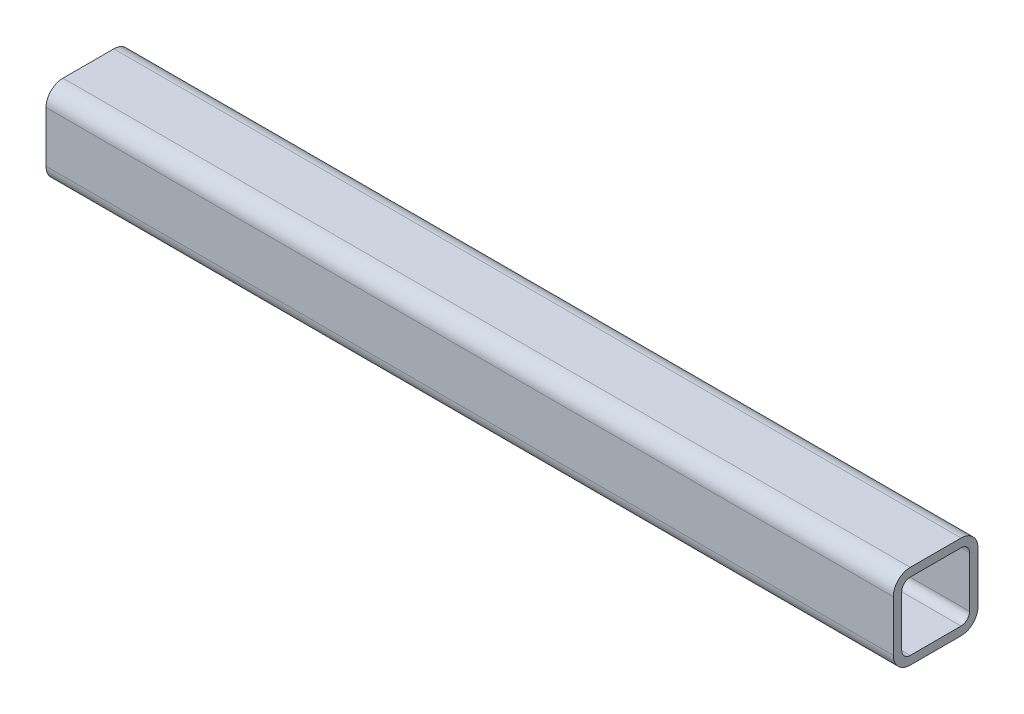
ISO-10303-21;
HEADER;
FILE_DESCRIPTION(('STEP AP214'),'2;1');
FILE_NAME('part.step','',(''),(''),'','','');
FILE_SCHEMA(('AUTOMOTIVE_DESIGN { 1 0 10303 214 1 1 1 1 }'));
ENDSEC;
DATA;
#1=APPLICATION_CONTEXT('core data for automotive mechanical design processes');
#2=APPLICATION_PROTOCOL_DEFINITION('international standard','automotive_design',2000,#1);
#3=PRODUCT_CONTEXT('',#1,'mechanical');
#4=PRODUCT('Part','Part','',(#3));
#5=PRODUCT_RELATED_PRODUCT_CATEGORY('part','',(#4));
#6=PRODUCT_DEFINITION_FORMATION('','',#4);
#7=PRODUCT_DEFINITION_CONTEXT('part definition',#1,'design');
#8=PRODUCT_DEFINITION('design','',#6,#7);
#9=PRODUCT_DEFINITION_SHAPE('','',#8);
#10=(LENGTH_UNIT() NAMED_UNIT(*) SI_UNIT(.MILLI.,.METRE.));
#11=(NAMED_UNIT(*) PLANE_ANGLE_UNIT() SI_UNIT($,.RADIAN.));
#12=(NAMED_UNIT(*) SI_UNIT($,.STERADIAN.) SOLID_ANGLE_UNIT());
#13=UNCERTAINTY_MEASURE_WITH_UNIT(LENGTH_MEASURE(1.E-05),#10,'distance_accuracy_value','');
#14=(GEOMETRIC_REPRESENTATION_CONTEXT(3) GLOBAL_UNCERTAINTY_ASSIGNED_CONTEXT((#13)) GLOBAL_UNIT_ASSIGNED_CONTEXT((#10,
#11,#12)) REPRESENTATION_CONTEXT('',''));
#15=CARTESIAN_POINT('',(0.,0.,0.));
#16=DIRECTION('',(0.,0.,1.));
#17=DIRECTION('',(1.,0.,0.));
#18=AXIS2_PLACEMENT_3D('',#15,#16,#17);
#19=CARTESIAN_POINT('',(99.9999999999993,-80.0000000000002,-559.));
#20=DIRECTION('',(1.,0.,0.));
#21=DIRECTION('',(0.,0.,-1.));
#22=AXIS2_PLACEMENT_3D('',#19,#20,#21);
#23=PLANE('',#22);
#24=DIRECTION('',(0.,1.,0.));
#25=VECTOR('',#24,1.);
#26=CARTESIAN_POINT('',(99.9999999999993,-86.,-560.));
#27=LINE('',#26,#25);
#28=CARTESIAN_POINT('',(99.9999999999993,-86.0000000000005,-560.));
#29=VERTEX_POINT('',#28);
#30=CARTESIAN_POINT('',(99.9999999999993,-74.0000000000005,-560.));
#31=VERTEX_POINT('',#30);
#32=EDGE_CURVE('E11',#29,#31,#27,.T.);
#33=ORIENTED_EDGE('',*,*,#32,.T.);
#34=CARTESIAN_POINT('',(99.9999999999993,-74.,-556.));
#35=DIRECTION('',(1.,0.,0.));
#36=DIRECTION('',(0.,0.,-1.));
#37=AXIS2_PLACEMENT_3D('',#34,#35,#36);
#38=CIRCLE('',#37,4.);
#39=CARTESIAN_POINT('',(99.9999999999993,-70.,-556.));
#40=VERTEX_POINT('',#39);
#41=EDGE_CURVE('E249',#31,#40,#38,.T.);
#42=ORIENTED_EDGE('',*,*,#41,.T.);
#43=DIRECTION('',(0.,0.,1.));
#44=VECTOR('',#43,1.);
#45=CARTESIAN_POINT('',(99.9999999999993,-70.,-544.));
#46=LINE('',#45,#44);
#47=CARTESIAN_POINT('',(99.9999999999993,-70.,-544.));
#48=VERTEX_POINT('',#47);
#49=EDGE_CURVE('E246',#40,#48,#46,.T.);
#50=ORIENTED_EDGE('',*,*,#49,.T.);
#51=CARTESIAN_POINT('',(99.9999999999993,-74.,-544.));
#52=DIRECTION('',(1.,0.,0.));
#53=DIRECTION('',(0.,0.,-1.));
#54=AXIS2_PLACEMENT_3D('',#51,#52,#53);
#55=CIRCLE('',#54,4.);
#56=CARTESIAN_POINT('',(99.9999999999993,-74.,-540.));
#57=VERTEX_POINT('',#56);
#58=EDGE_CURVE('E243',#48,#57,#55,.T.);
#59=ORIENTED_EDGE('',*,*,#58,.T.);
#60=DIRECTION('',(0.,-1.,0.));
#61=VECTOR('',#60,1.);
#62=CARTESIAN_POINT('',(99.9999999999993,-74.,-540.));
#63=LINE('',#62,#61);
#64=CARTESIAN_POINT('',(99.9999999999993,-86.,-540.));
#65=VERTEX_POINT('',#64);
#66=EDGE_CURVE('E240',#57,#65,#63,.T.);
#67=ORIENTED_EDGE('',*,*,#66,.T.);
#68=CARTESIAN_POINT('',(99.9999999999993,-86.,-544.));
#69=DIRECTION('',(1.,0.,0.));
#70=DIRECTION('',(0.,0.,-1.));
#71=AXIS2_PLACEMENT_3D('',#68,#69,#70);
#72=CIRCLE('',#71,4.);
#73=CARTESIAN_POINT('',(99.9999999999993,-90.,-544.));
#74=VERTEX_POINT('',#73);
#75=EDGE_CURVE('E237',#65,#74,#72,.T.);
#76=ORIENTED_EDGE('',*,*,#75,.T.);
#77=DIRECTION('',(0.,0.,-1.));
#78=VECTOR('',#77,1.);
#79=CARTESIAN_POINT('',(99.9999999999993,-90.,-556.));
#80=LINE('',#79,#78);
#81=CARTESIAN_POINT('',(99.9999999999993,-90.,-556.));
#82=VERTEX_POINT('',#81);
#83=EDGE_CURVE('E234',#74,#82,#80,.T.);
#84=ORIENTED_EDGE('',*,*,#83,.T.);
#85=CARTESIAN_POINT('',(99.9999999999993,-86.,-556.));
#86=DIRECTION('',(1.,0.,0.));
#87=DIRECTION('',(0.,0.,-1.));
#88=AXIS2_PLACEMENT_3D('',#85,#86,#87);
#89=CIRCLE('',#88,4.);
#90=EDGE_CURVE('E185',#82,#29,#89,.T.);
#91=ORIENTED_EDGE('',*,*,#90,.T.);
#92=EDGE_LOOP('',(#33,#42,#50,#59,#67,#76,#84,#91));
#93=FACE_BOUND('',#92,.T.);
#94=CARTESIAN_POINT('',(99.9999999999993,-74.,-556.));
#95=DIRECTION('',(1.,0.,0.));
#96=DIRECTION('',(0.,0.,-1.));
#97=AXIS2_PLACEMENT_3D('',#94,#95,#96);
#98=CIRCLE('',#97,2.);
#99=CARTESIAN_POINT('',(99.9999999999993,-74.,-558.));
#100=VERTEX_POINT('',#99);
#101=CARTESIAN_POINT('',(99.9999999999993,-72.,-556.));
#102=VERTEX_POINT('',#101);
#103=EDGE_CURVE('E217',#100,#102,#98,.T.);
#104=ORIENTED_EDGE('',*,*,#103,.F.);
#105=DIRECTION('',(0.,1.,0.));
#106=VECTOR('',#105,1.);
#107=CARTESIAN_POINT('',(99.9999999999993,-86.,-558.));
#108=LINE('',#107,#106);
#109=CARTESIAN_POINT('',(99.9999999999993,-86.0000000000005,-558.));
#110=VERTEX_POINT('',#109);
#111=EDGE_CURVE('E173',#110,#100,#108,.T.);
#112=ORIENTED_EDGE('',*,*,#111,.F.);
#113=CARTESIAN_POINT('',(99.9999999999993,-86.,-556.));
#114=DIRECTION('',(1.,0.,0.));
#115=DIRECTION('',(0.,0.,-1.));
#116=AXIS2_PLACEMENT_3D('',#113,#114,#115);
#117=CIRCLE('',#116,2.);
#118=CARTESIAN_POINT('',(99.9999999999993,-88.,-556.));
#119=VERTEX_POINT('',#118);
#120=EDGE_CURVE('E70',#119,#110,#117,.T.);
#121=ORIENTED_EDGE('',*,*,#120,.F.);
#122=DIRECTION('',(0.,0.,-1.));
#123=VECTOR('',#122,1.);
#124=CARTESIAN_POINT('',(99.9999999999993,-88.,-556.));
#125=LINE('',#124,#123);
#126=CARTESIAN_POINT('',(99.9999999999993,-88.,-544.));
#127=VERTEX_POINT('',#126);
#128=EDGE_CURVE('E82',#127,#119,#125,.T.);
#129=ORIENTED_EDGE('',*,*,#128,.F.);
#130=CARTESIAN_POINT('',(99.9999999999993,-86.,-544.));
#131=DIRECTION('',(1.,0.,0.));
#132=DIRECTION('',(0.,0.,-1.));
#133=AXIS2_PLACEMENT_3D('',#130,#131,#132);
#134=CIRCLE('',#133,2.);
#135=CARTESIAN_POINT('',(99.9999999999993,-86.,-542.));
#136=VERTEX_POINT('',#135);
#137=EDGE_CURVE('E222',#136,#127,#134,.T.);
#138=ORIENTED_EDGE('',*,*,#137,.F.);
#139=DIRECTION('',(0.,-1.,0.));
#140=VECTOR('',#139,1.);
#141=CARTESIAN_POINT('',(99.9999999999993,-74.,-542.));
#142=LINE('',#141,#140);
#143=CARTESIAN_POINT('',(99.9999999999993,-74.,-542.));
#144=VERTEX_POINT('',#143);
#145=EDGE_CURVE('E212',#144,#136,#142,.T.);
#146=ORIENTED_EDGE('',*,*,#145,.F.);
#147=CARTESIAN_POINT('',(99.9999999999993,-74.,-544.));
#148=DIRECTION('',(1.,0.,0.));
#149=DIRECTION('',(0.,0.,-1.));
#150=AXIS2_PLACEMENT_3D('',#147,#148,#149);
#151=CIRCLE('',#150,2.);
#152=CARTESIAN_POINT('',(99.9999999999993,-72.,-544.));
#153=VERTEX_POINT('',#152);
#154=EDGE_CURVE('E209',#153,#144,#151,.T.);
#155=ORIENTED_EDGE('',*,*,#154,.F.);
#156=DIRECTION('',(0.,0.,1.));
#157=VECTOR('',#156,1.);
#158=CARTESIAN_POINT('',(99.9999999999993,-72.,-544.));
#159=LINE('',#158,#157);
#160=EDGE_CURVE('E204',#102,#153,#159,.T.);
#161=ORIENTED_EDGE('',*,*,#160,.F.);
#162=EDGE_LOOP('',(#104,#112,#121,#129,#138,#146,#155,#161));
#163=FACE_BOUND('',#162,.T.);
#164=ADVANCED_FACE('F41',(#93,#163),#23,.T.);
#165=CARTESIAN_POINT('',(-100.,-74.0000000000004,-550.));
#166=DIRECTION('',(-1.,0.,0.));
#167=DIRECTION('',(0.,0.,1.));
#168=AXIS2_PLACEMENT_3D('',#165,#166,#167);
#169=PLANE('',#168);
#170=CARTESIAN_POINT('',(-100.,-74.,-556.));
#171=DIRECTION('',(-1.,0.,0.));
#172=DIRECTION('',(0.,0.,1.));
#173=AXIS2_PLACEMENT_3D('',#170,#171,#172);
#174=CIRCLE('',#173,4.);
#175=CARTESIAN_POINT('',(-100.,-70.,-556.));
#176=VERTEX_POINT('',#175);
#177=CARTESIAN_POINT('',(-100.,-74.0000000000004,-560.));
#178=VERTEX_POINT('',#177);
#179=EDGE_CURVE('E190',#176,#178,#174,.T.);
#180=ORIENTED_EDGE('',*,*,#179,.T.);
#181=DIRECTION('',(0.,-1.,0.));
#182=VECTOR('',#181,1.);
#183=CARTESIAN_POINT('',(-100.,-86.,-560.));
#184=LINE('',#183,#182);
#185=CARTESIAN_POINT('',(-100.,-86.0000000000004,-560.));
#186=VERTEX_POINT('',#185);
#187=EDGE_CURVE('E182',#178,#186,#184,.T.);
#188=ORIENTED_EDGE('',*,*,#187,.T.);
#189=CARTESIAN_POINT('',(-100.,-86.,-556.));
#190=DIRECTION('',(-1.,0.,0.));
#191=DIRECTION('',(0.,0.,1.));
#192=AXIS2_PLACEMENT_3D('',#189,#190,#191);
#193=CIRCLE('',#192,4.);
#194=CARTESIAN_POINT('',(-100.,-90.,-556.));
#195=VERTEX_POINT('',#194);
#196=EDGE_CURVE('E192',#186,#195,#193,.T.);
#197=ORIENTED_EDGE('',*,*,#196,.T.);
#198=DIRECTION('',(0.,0.,1.));
#199=VECTOR('',#198,1.);
#200=CARTESIAN_POINT('',(-100.,-90.,-556.));
#201=LINE('',#200,#199);
#202=CARTESIAN_POINT('',(-100.,-90.,-544.));
#203=VERTEX_POINT('',#202);
#204=EDGE_CURVE('E194',#195,#203,#201,.T.);
#205=ORIENTED_EDGE('',*,*,#204,.T.);
#206=CARTESIAN_POINT('',(-100.,-86.,-544.));
#207=DIRECTION('',(-1.,0.,0.));
#208=DIRECTION('',(0.,0.,1.));
#209=AXIS2_PLACEMENT_3D('',#206,#207,#208);
#210=CIRCLE('',#209,4.);
#211=CARTESIAN_POINT('',(-100.,-86.,-540.));
#212=VERTEX_POINT('',#211);
#213=EDGE_CURVE('E196',#203,#212,#210,.T.);
#214=ORIENTED_EDGE('',*,*,#213,.T.);
#215=DIRECTION('',(0.,1.,0.));
#216=VECTOR('',#215,1.);
#217=CARTESIAN_POINT('',(-100.,-74.,-540.));
#218=LINE('',#217,#216);
#219=CARTESIAN_POINT('',(-100.,-74.,-540.));
#220=VERTEX_POINT('',#219);
#221=EDGE_CURVE('E184',#212,#220,#218,.T.);
#222=ORIENTED_EDGE('',*,*,#221,.T.);
#223=CARTESIAN_POINT('',(-100.,-74.,-544.));
#224=DIRECTION('',(-1.,0.,0.));
#225=DIRECTION('',(0.,0.,1.));
#226=AXIS2_PLACEMENT_3D('',#223,#224,#225);
#227=CIRCLE('',#226,4.);
#228=CARTESIAN_POINT('',(-100.,-70.,-544.));
#229=VERTEX_POINT('',#228);
#230=EDGE_CURVE('E186',#220,#229,#227,.T.);
#231=ORIENTED_EDGE('',*,*,#230,.T.);
#232=DIRECTION('',(0.,0.,-1.));
#233=VECTOR('',#232,1.);
#234=CARTESIAN_POINT('',(-100.,-70.,-544.));
#235=LINE('',#234,#233);
#236=EDGE_CURVE('E188',#229,#176,#235,.T.);
#237=ORIENTED_EDGE('',*,*,#236,.T.);
#238=EDGE_LOOP('',(#180,#188,#197,#205,#214,#222,#231,#237));
#239=FACE_BOUND('',#238,.T.);
#240=DIRECTION('',(0.,-1.,0.));
#241=VECTOR('',#240,1.);
#242=CARTESIAN_POINT('',(-100.,-86.,-558.));
#243=LINE('',#242,#241);
#244=CARTESIAN_POINT('',(-100.,-74.0000000000004,-558.));
#245=VERTEX_POINT('',#244);
#246=CARTESIAN_POINT('',(-100.,-86.,-558.));
#247=VERTEX_POINT('',#246);
#248=EDGE_CURVE('E163',#245,#247,#243,.T.);
#249=ORIENTED_EDGE('',*,*,#248,.F.);
#250=CARTESIAN_POINT('',(-100.,-74.,-556.));
#251=DIRECTION('',(-1.,0.,0.));
#252=DIRECTION('',(0.,0.,1.));
#253=AXIS2_PLACEMENT_3D('',#250,#251,#252);
#254=CIRCLE('',#253,2.);
#255=CARTESIAN_POINT('',(-100.,-72.,-556.));
#256=VERTEX_POINT('',#255);
#257=EDGE_CURVE('E213',#256,#245,#254,.T.);
#258=ORIENTED_EDGE('',*,*,#257,.F.);
#259=DIRECTION('',(0.,0.,-1.));
#260=VECTOR('',#259,1.);
#261=CARTESIAN_POINT('',(-100.,-72.,-544.));
#262=LINE('',#261,#260);
#263=CARTESIAN_POINT('',(-100.,-72.,-544.));
#264=VERTEX_POINT('',#263);
#265=EDGE_CURVE('E200',#264,#256,#262,.T.);
#266=ORIENTED_EDGE('',*,*,#265,.F.);
#267=CARTESIAN_POINT('',(-100.,-74.,-544.));
#268=DIRECTION('',(-1.,0.,0.));
#269=DIRECTION('',(0.,0.,1.));
#270=AXIS2_PLACEMENT_3D('',#267,#268,#269);
#271=CIRCLE('',#270,2.);
#272=CARTESIAN_POINT('',(-100.,-74.,-542.));
#273=VERTEX_POINT('',#272);
#274=EDGE_CURVE('E205',#273,#264,#271,.T.);
#275=ORIENTED_EDGE('',*,*,#274,.F.);
#276=DIRECTION('',(0.,1.,0.));
#277=VECTOR('',#276,1.);
#278=CARTESIAN_POINT('',(-100.,-74.,-542.));
#279=LINE('',#278,#277);
#280=CARTESIAN_POINT('',(-100.,-86.,-542.));
#281=VERTEX_POINT('',#280);
#282=EDGE_CURVE('E174',#281,#273,#279,.T.);
#283=ORIENTED_EDGE('',*,*,#282,.F.);
#284=CARTESIAN_POINT('',(-100.,-86.,-544.));
#285=DIRECTION('',(-1.,0.,0.));
#286=DIRECTION('',(0.,0.,1.));
#287=AXIS2_PLACEMENT_3D('',#284,#285,#286);
#288=CIRCLE('',#287,2.);
#289=CARTESIAN_POINT('',(-100.,-88.,-544.));
#290=VERTEX_POINT('',#289);
#291=EDGE_CURVE('E218',#290,#281,#288,.T.);
#292=ORIENTED_EDGE('',*,*,#291,.F.);
#293=DIRECTION('',(0.,0.,1.));
#294=VECTOR('',#293,1.);
#295=CARTESIAN_POINT('',(-100.,-88.,-556.));
#296=LINE('',#295,#294);
#297=CARTESIAN_POINT('',(-100.,-88.,-556.));
#298=VERTEX_POINT('',#297);
#299=EDGE_CURVE('E166',#298,#290,#296,.T.);
#300=ORIENTED_EDGE('',*,*,#299,.F.);
#301=CARTESIAN_POINT('',(-100.,-86.,-556.));
#302=DIRECTION('',(-1.,0.,0.));
#303=DIRECTION('',(0.,0.,1.));
#304=AXIS2_PLACEMENT_3D('',#301,#302,#303);
#305=CIRCLE('',#304,2.);
#306=EDGE_CURVE('E160',#247,#298,#305,.T.);
#307=ORIENTED_EDGE('',*,*,#306,.F.);
#308=EDGE_LOOP('',(#249,#258,#266,#275,#283,#292,#300,#307));
#309=FACE_BOUND('',#308,.T.);
#310=ADVANCED_FACE('F161',(#239,#309),#169,.T.);
#311=CARTESIAN_POINT('',(-110.,-86.,-544.));
#312=DIRECTION('',(1.,0.,0.));
#313=DIRECTION('',(0.,0.,-1.));
#314=AXIS2_PLACEMENT_3D('',#311,#312,#313);
#315=CYLINDRICAL_SURFACE('',#314,2.);
#316=DIRECTION('',(1.,0.,0.));
#317=VECTOR('',#316,1.);
#318=CARTESIAN_POINT('',(-110.,-86.,-542.));
#319=LINE('',#318,#317);
#320=EDGE_CURVE('E198',#281,#136,#319,.T.);
#321=ORIENTED_EDGE('',*,*,#320,.T.);
#322=ORIENTED_EDGE('',*,*,#137,.T.);
#323=DIRECTION('',(1.,0.,0.));
#324=VECTOR('',#323,1.);
#325=CARTESIAN_POINT('',(-110.,-88.,-544.));
#326=LINE('',#325,#324);
#327=EDGE_CURVE('E221',#290,#127,#326,.T.);
#328=ORIENTED_EDGE('',*,*,#327,.F.);
#329=ORIENTED_EDGE('',*,*,#291,.T.);
#330=EDGE_LOOP('',(#321,#322,#328,#329));
#331=FACE_BOUND('',#330,.T.);
#332=ADVANCED_FACE('F299',(#331),#315,.F.);
#333=CARTESIAN_POINT('',(-110.,-88.,-556.));
#334=DIRECTION('',(0.,1.,0.));
#335=DIRECTION('',(0.,0.,1.));
#336=AXIS2_PLACEMENT_3D('',#333,#334,#335);
#337=PLANE('',#336);
#338=ORIENTED_EDGE('',*,*,#327,.T.);
#339=ORIENTED_EDGE('',*,*,#128,.T.);
#340=DIRECTION('',(1.,0.,0.));
#341=VECTOR('',#340,1.);
#342=CARTESIAN_POINT('',(-110.,-88.,-556.));
#343=LINE('',#342,#341);
#344=EDGE_CURVE('E223',#298,#119,#343,.T.);
#345=ORIENTED_EDGE('',*,*,#344,.F.);
#346=ORIENTED_EDGE('',*,*,#299,.T.);
#347=EDGE_LOOP('',(#338,#339,#345,#346));
#348=FACE_BOUND('',#347,.T.);
#349=ADVANCED_FACE('F300',(#348),#337,.T.);
#350=CARTESIAN_POINT('',(-110.,-86.,-556.));
#351=DIRECTION('',(1.,0.,0.));
#352=DIRECTION('',(0.,0.,-1.));
#353=AXIS2_PLACEMENT_3D('',#350,#351,#352);
#354=CYLINDRICAL_SURFACE('',#353,2.);
#355=ORIENTED_EDGE('',*,*,#344,.T.);
#356=ORIENTED_EDGE('',*,*,#120,.T.);
#357=DIRECTION('',(1.,0.,0.));
#358=VECTOR('',#357,1.);
#359=CARTESIAN_POINT('',(-110.,-86.,-558.));
#360=LINE('',#359,#358);
#361=EDGE_CURVE('E169',#247,#110,#360,.T.);
#362=ORIENTED_EDGE('',*,*,#361,.F.);
#363=ORIENTED_EDGE('',*,*,#306,.T.);
#364=EDGE_LOOP('',(#355,#356,#362,#363));
#365=FACE_BOUND('',#364,.T.);
#366=ADVANCED_FACE('F170',(#365),#354,.F.);
#367=CARTESIAN_POINT('',(-110.,-74.,-556.));
#368=DIRECTION('',(1.,0.,0.));
#369=DIRECTION('',(0.,0.,-1.));
#370=AXIS2_PLACEMENT_3D('',#367,#368,#369);
#371=CYLINDRICAL_SURFACE('',#370,2.);
#372=DIRECTION('',(1.,0.,0.));
#373=VECTOR('',#372,1.);
#374=CARTESIAN_POINT('',(-110.,-74.,-558.));
#375=LINE('',#374,#373);
#376=EDGE_CURVE('E44',#245,#100,#375,.T.);
#377=ORIENTED_EDGE('',*,*,#376,.T.);
#378=ORIENTED_EDGE('',*,*,#103,.T.);
#379=DIRECTION('',(1.,0.,0.));
#380=VECTOR('',#379,1.);
#381=CARTESIAN_POINT('',(-110.,-72.,-556.));
#382=LINE('',#381,#380);
#383=EDGE_CURVE('E216',#256,#102,#382,.T.);
#384=ORIENTED_EDGE('',*,*,#383,.F.);
#385=ORIENTED_EDGE('',*,*,#257,.T.);
#386=EDGE_LOOP('',(#377,#378,#384,#385));
#387=FACE_BOUND('',#386,.T.);
#388=ADVANCED_FACE('F286',(#387),#371,.F.);
#389=CARTESIAN_POINT('',(-110.,-72.,-544.));
#390=DIRECTION('',(0.,-1.,0.));
#391=DIRECTION('',(0.,0.,-1.));
#392=AXIS2_PLACEMENT_3D('',#389,#390,#391);
#393=PLANE('',#392);
#394=ORIENTED_EDGE('',*,*,#383,.T.);
#395=ORIENTED_EDGE('',*,*,#160,.T.);
#396=DIRECTION('',(1.,0.,0.));
#397=VECTOR('',#396,1.);
#398=CARTESIAN_POINT('',(-110.,-72.,-544.));
#399=LINE('',#398,#397);
#400=EDGE_CURVE('E203',#264,#153,#399,.T.);
#401=ORIENTED_EDGE('',*,*,#400,.F.);
#402=ORIENTED_EDGE('',*,*,#265,.T.);
#403=EDGE_LOOP('',(#394,#395,#401,#402));
#404=FACE_BOUND('',#403,.T.);
#405=ADVANCED_FACE('F288',(#404),#393,.T.);
#406=CARTESIAN_POINT('',(-110.,-74.,-544.));
#407=DIRECTION('',(1.,0.,0.));
#408=DIRECTION('',(0.,0.,-1.));
#409=AXIS2_PLACEMENT_3D('',#406,#407,#408);
#410=CYLINDRICAL_SURFACE('',#409,2.);
#411=ORIENTED_EDGE('',*,*,#400,.T.);
#412=ORIENTED_EDGE('',*,*,#154,.T.);
#413=DIRECTION('',(1.,0.,0.));
#414=VECTOR('',#413,1.);
#415=CARTESIAN_POINT('',(-110.,-74.,-542.));
#416=LINE('',#415,#414);
#417=EDGE_CURVE('E208',#273,#144,#416,.T.);
#418=ORIENTED_EDGE('',*,*,#417,.F.);
#419=ORIENTED_EDGE('',*,*,#274,.T.);
#420=EDGE_LOOP('',(#411,#412,#418,#419));
#421=FACE_BOUND('',#420,.T.);
#422=ADVANCED_FACE('F293',(#421),#410,.F.);
#423=CARTESIAN_POINT('',(-110.,-74.,-542.));
#424=DIRECTION('',(0.,0.,-1.));
#425=DIRECTION('',(-1.,0.,0.));
#426=AXIS2_PLACEMENT_3D('',#423,#424,#425);
#427=PLANE('',#426);
#428=ORIENTED_EDGE('',*,*,#417,.T.);
#429=ORIENTED_EDGE('',*,*,#145,.T.);
#430=ORIENTED_EDGE('',*,*,#320,.F.);
#431=ORIENTED_EDGE('',*,*,#282,.T.);
#432=EDGE_LOOP('',(#428,#429,#430,#431));
#433=FACE_BOUND('',#432,.T.);
#434=ADVANCED_FACE('F296',(#433),#427,.T.);
#435=CARTESIAN_POINT('',(-110.,-86.,-558.));
#436=DIRECTION('',(0.,0.,1.));
#437=DIRECTION('',(1.,0.,0.));
#438=AXIS2_PLACEMENT_3D('',#435,#436,#437);
#439=PLANE('',#438);
#440=ORIENTED_EDGE('',*,*,#361,.T.);
#441=ORIENTED_EDGE('',*,*,#111,.T.);
#442=ORIENTED_EDGE('',*,*,#376,.F.);
#443=ORIENTED_EDGE('',*,*,#248,.T.);
#444=EDGE_LOOP('',(#440,#441,#442,#443));
#445=FACE_BOUND('',#444,.T.);
#446=ADVANCED_FACE('F175',(#445),#439,.T.);
#447=CARTESIAN_POINT('',(-110.,-86.,-556.));
#448=DIRECTION('',(1.,0.,0.));
#449=DIRECTION('',(0.,0.,-1.));
#450=AXIS2_PLACEMENT_3D('',#447,#448,#449);
#451=CYLINDRICAL_SURFACE('',#450,4.);
#452=ORIENTED_EDGE('',*,*,#90,.F.);
#453=DIRECTION('',(1.,0.,0.));
#454=VECTOR('',#453,1.);
#455=CARTESIAN_POINT('',(-110.,-90.,-556.));
#456=LINE('',#455,#454);
#457=EDGE_CURVE('E256',#195,#82,#456,.T.);
#458=ORIENTED_EDGE('',*,*,#457,.F.);
#459=ORIENTED_EDGE('',*,*,#196,.F.);
#460=DIRECTION('',(1.,0.,0.));
#461=VECTOR('',#460,1.);
#462=CARTESIAN_POINT('',(-110.,-86.,-560.));
#463=LINE('',#462,#461);
#464=EDGE_CURVE('E176',#186,#29,#463,.T.);
#465=ORIENTED_EDGE('',*,*,#464,.T.);
#466=EDGE_LOOP('',(#452,#458,#459,#465));
#467=FACE_BOUND('',#466,.T.);
#468=ADVANCED_FACE('F345',(#467),#451,.T.);
#469=CARTESIAN_POINT('',(-110.,-86.,-544.));
#470=DIRECTION('',(1.,0.,0.));
#471=DIRECTION('',(0.,0.,-1.));
#472=AXIS2_PLACEMENT_3D('',#469,#470,#471);
#473=CYLINDRICAL_SURFACE('',#472,4.);
#474=ORIENTED_EDGE('',*,*,#75,.F.);
#475=DIRECTION('',(1.,0.,0.));
#476=VECTOR('',#475,1.);
#477=CARTESIAN_POINT('',(-110.,-86.,-540.));
#478=LINE('',#477,#476);
#479=EDGE_CURVE('E265',#212,#65,#478,.T.);
#480=ORIENTED_EDGE('',*,*,#479,.F.);
#481=ORIENTED_EDGE('',*,*,#213,.F.);
#482=DIRECTION('',(1.,0.,0.));
#483=VECTOR('',#482,1.);
#484=CARTESIAN_POINT('',(-110.,-90.,-544.));
#485=LINE('',#484,#483);
#486=EDGE_CURVE('E178',#203,#74,#485,.T.);
#487=ORIENTED_EDGE('',*,*,#486,.T.);
#488=EDGE_LOOP('',(#474,#480,#481,#487));
#489=FACE_BOUND('',#488,.T.);
#490=ADVANCED_FACE('F337',(#489),#473,.T.);
#491=CARTESIAN_POINT('',(-110.,-74.,-540.));
#492=DIRECTION('',(0.,0.,-1.));
#493=DIRECTION('',(-1.,0.,0.));
#494=AXIS2_PLACEMENT_3D('',#491,#492,#493);
#495=PLANE('',#494);
#496=ORIENTED_EDGE('',*,*,#66,.F.);
#497=DIRECTION('',(1.,0.,0.));
#498=VECTOR('',#497,1.);
#499=CARTESIAN_POINT('',(-110.,-74.,-540.));
#500=LINE('',#499,#498);
#501=EDGE_CURVE('E262',#220,#57,#500,.T.);
#502=ORIENTED_EDGE('',*,*,#501,.F.);
#503=ORIENTED_EDGE('',*,*,#221,.F.);
#504=ORIENTED_EDGE('',*,*,#479,.T.);
#505=EDGE_LOOP('',(#496,#502,#503,#504));
#506=FACE_BOUND('',#505,.T.);
#507=ADVANCED_FACE('F333',(#506),#495,.F.);
#508=CARTESIAN_POINT('',(-110.,-74.,-544.));
#509=DIRECTION('',(1.,0.,0.));
#510=DIRECTION('',(0.,0.,-1.));
#511=AXIS2_PLACEMENT_3D('',#508,#509,#510);
#512=CYLINDRICAL_SURFACE('',#511,4.);
#513=ORIENTED_EDGE('',*,*,#58,.F.);
#514=DIRECTION('',(1.,0.,0.));
#515=VECTOR('',#514,1.);
#516=CARTESIAN_POINT('',(-110.,-70.,-544.));
#517=LINE('',#516,#515);
#518=EDGE_CURVE('E252',#229,#48,#517,.T.);
#519=ORIENTED_EDGE('',*,*,#518,.F.);
#520=ORIENTED_EDGE('',*,*,#230,.F.);
#521=ORIENTED_EDGE('',*,*,#501,.T.);
#522=EDGE_LOOP('',(#513,#519,#520,#521));
#523=FACE_BOUND('',#522,.T.);
#524=ADVANCED_FACE('F328',(#523),#512,.T.);
#525=CARTESIAN_POINT('',(-110.,-90.,-556.));
#526=DIRECTION('',(0.,1.,0.));
#527=DIRECTION('',(0.,0.,1.));
#528=AXIS2_PLACEMENT_3D('',#525,#526,#527);
#529=PLANE('',#528);
#530=ORIENTED_EDGE('',*,*,#83,.F.);
#531=ORIENTED_EDGE('',*,*,#486,.F.);
#532=ORIENTED_EDGE('',*,*,#204,.F.);
#533=ORIENTED_EDGE('',*,*,#457,.T.);
#534=EDGE_LOOP('',(#530,#531,#532,#533));
#535=FACE_BOUND('',#534,.T.);
#536=ADVANCED_FACE('F340',(#535),#529,.F.);
#537=CARTESIAN_POINT('',(-110.,-70.,-544.));
#538=DIRECTION('',(0.,-1.,0.));
#539=DIRECTION('',(0.,0.,-1.));
#540=AXIS2_PLACEMENT_3D('',#537,#538,#539);
#541=PLANE('',#540);
#542=ORIENTED_EDGE('',*,*,#49,.F.);
#543=DIRECTION('',(1.,0.,0.));
#544=VECTOR('',#543,1.);
#545=CARTESIAN_POINT('',(-110.,-70.,-556.));
#546=LINE('',#545,#544);
#547=EDGE_CURVE('E255',#176,#40,#546,.T.);
#548=ORIENTED_EDGE('',*,*,#547,.F.);
#549=ORIENTED_EDGE('',*,*,#236,.F.);
#550=ORIENTED_EDGE('',*,*,#518,.T.);
#551=EDGE_LOOP('',(#542,#548,#549,#550));
#552=FACE_BOUND('',#551,.T.);
#553=ADVANCED_FACE('F325',(#552),#541,.F.);
#554=CARTESIAN_POINT('',(-110.,-74.,-556.));
#555=DIRECTION('',(1.,0.,0.));
#556=DIRECTION('',(0.,0.,-1.));
#557=AXIS2_PLACEMENT_3D('',#554,#555,#556);
#558=CYLINDRICAL_SURFACE('',#557,4.);
#559=ORIENTED_EDGE('',*,*,#41,.F.);
#560=DIRECTION('',(1.,0.,0.));
#561=VECTOR('',#560,1.);
#562=CARTESIAN_POINT('',(-110.,-74.,-560.));
#563=LINE('',#562,#561);
#564=EDGE_CURVE('E50',#178,#31,#563,.T.);
#565=ORIENTED_EDGE('',*,*,#564,.F.);
#566=ORIENTED_EDGE('',*,*,#179,.F.);
#567=ORIENTED_EDGE('',*,*,#547,.T.);
#568=EDGE_LOOP('',(#559,#565,#566,#567));
#569=FACE_BOUND('',#568,.T.);
#570=ADVANCED_FACE('F319',(#569),#558,.T.);
#571=CARTESIAN_POINT('',(-110.,-86.,-560.));
#572=DIRECTION('',(0.,0.,1.));
#573=DIRECTION('',(1.,0.,0.));
#574=AXIS2_PLACEMENT_3D('',#571,#572,#573);
#575=PLANE('',#574);
#576=ORIENTED_EDGE('',*,*,#32,.F.);
#577=ORIENTED_EDGE('',*,*,#464,.F.);
#578=ORIENTED_EDGE('',*,*,#187,.F.);
#579=ORIENTED_EDGE('',*,*,#564,.T.);
#580=EDGE_LOOP('',(#576,#577,#578,#579));
#581=FACE_BOUND('',#580,.T.);
#582=ADVANCED_FACE('F346',(#581),#575,.F.);
#583=CLOSED_SHELL('',(#164,#310,#332,#349,#366,#388,#405,#422,#434,#446,#468,#490,#507,#524,
#536,#553,#570,#582));
#584=MANIFOLD_SOLID_BREP('B2',#583);
#585=ADVANCED_BREP_SHAPE_REPRESENTATION('',(#18,#584),#14);
#586=SHAPE_DEFINITION_REPRESENTATION(#9,#585);
ENDSEC;
END-ISO-10303-21;
